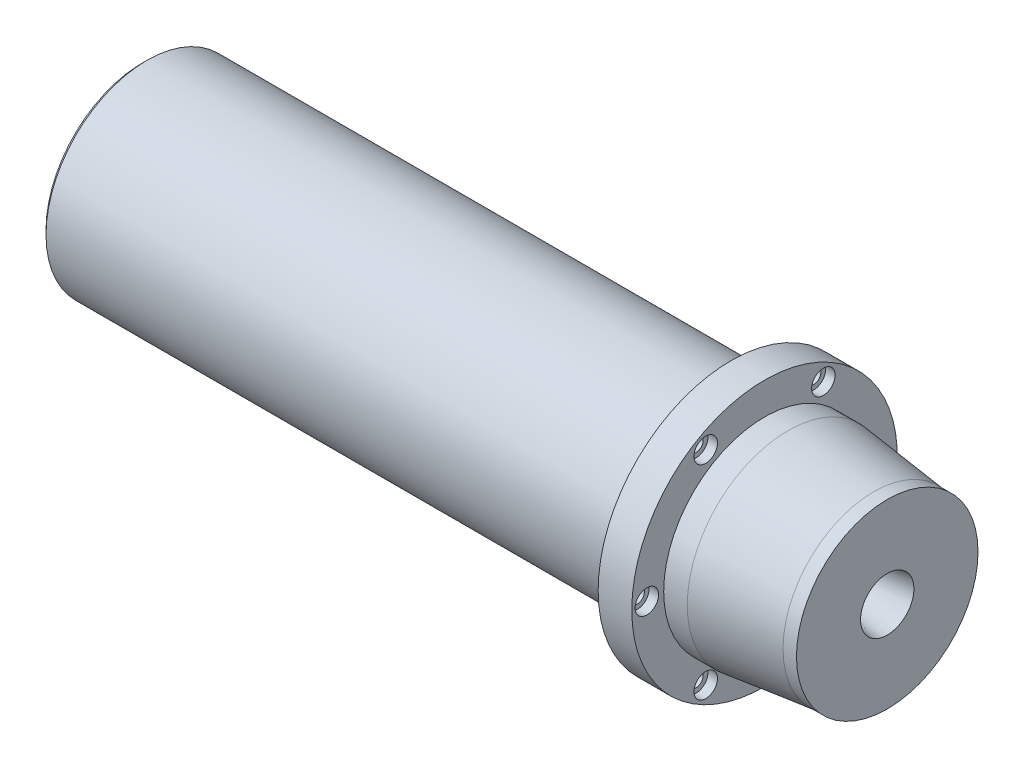
ISO-10303-21;
HEADER;
FILE_DESCRIPTION(('STEP AP214'),'2;1');
FILE_NAME('part.step','',(''),(''),'','','');
FILE_SCHEMA(('AUTOMOTIVE_DESIGN { 1 0 10303 214 1 1 1 1 }'));
ENDSEC;
DATA;
#1=APPLICATION_CONTEXT('core data for automotive mechanical design processes');
#2=APPLICATION_PROTOCOL_DEFINITION('international standard','automotive_design',2000,#1);
#3=PRODUCT_CONTEXT('',#1,'mechanical');
#4=PRODUCT('Part','Part','',(#3));
#5=PRODUCT_RELATED_PRODUCT_CATEGORY('part','',(#4));
#6=PRODUCT_DEFINITION_FORMATION('','',#4);
#7=PRODUCT_DEFINITION_CONTEXT('part definition',#1,'design');
#8=PRODUCT_DEFINITION('design','',#6,#7);
#9=PRODUCT_DEFINITION_SHAPE('','',#8);
#10=(LENGTH_UNIT() NAMED_UNIT(*) SI_UNIT(.MILLI.,.METRE.));
#11=(NAMED_UNIT(*) PLANE_ANGLE_UNIT() SI_UNIT($,.RADIAN.));
#12=(NAMED_UNIT(*) SI_UNIT($,.STERADIAN.) SOLID_ANGLE_UNIT());
#13=UNCERTAINTY_MEASURE_WITH_UNIT(LENGTH_MEASURE(1.E-05),#10,'distance_accuracy_value','');
#14=(GEOMETRIC_REPRESENTATION_CONTEXT(3) GLOBAL_UNCERTAINTY_ASSIGNED_CONTEXT((#13)) GLOBAL_UNIT_ASSIGNED_CONTEXT((#10,
#11,#12)) REPRESENTATION_CONTEXT('',''));
#15=CARTESIAN_POINT('',(0.,0.,0.));
#16=DIRECTION('',(0.,0.,1.));
#17=DIRECTION('',(1.,0.,0.));
#18=AXIS2_PLACEMENT_3D('',#15,#16,#17);
#19=CARTESIAN_POINT('',(0.,0.,0.));
#20=DIRECTION('',(1.,0.,0.));
#21=DIRECTION('',(0.,0.,-1.));
#22=AXIS2_PLACEMENT_3D('',#19,#20,#21);
#23=PLANE('',#22);
#24=CARTESIAN_POINT('',(0.,0.,0.));
#25=DIRECTION('',(1.,0.,0.));
#26=DIRECTION('',(0.,0.,-1.));
#27=AXIS2_PLACEMENT_3D('',#24,#25,#26);
#28=CIRCLE('',#27,57.5);
#29=CARTESIAN_POINT('',(0.,0.,-57.5));
#30=VERTEX_POINT('',#29);
#31=EDGE_CURVE('E54',#30,#30,#28,.F.);
#32=ORIENTED_EDGE('',*,*,#31,.T.);
#33=EDGE_LOOP('',(#32));
#34=FACE_BOUND('',#33,.T.);
#35=ADVANCED_FACE('F44',(#34),#23,.F.);
#36=CARTESIAN_POINT('',(0.,0.,0.));
#37=DIRECTION('',(-1.,0.,0.));
#38=DIRECTION('',(0.,0.,1.));
#39=AXIS2_PLACEMENT_3D('',#36,#37,#38);
#40=CYLINDRICAL_SURFACE('',#39,60.);
#41=CARTESIAN_POINT('',(2.49999999999991,0.,0.));
#42=DIRECTION('',(1.,0.,0.));
#43=DIRECTION('',(0.,0.,-1.));
#44=AXIS2_PLACEMENT_3D('',#41,#42,#43);
#45=CIRCLE('',#44,60.);
#46=CARTESIAN_POINT('',(2.49999999999991,0.,-60.));
#47=VERTEX_POINT('',#46);
#48=EDGE_CURVE('E10',#47,#47,#45,.T.);
#49=ORIENTED_EDGE('',*,*,#48,.T.);
#50=EDGE_LOOP('',(#49));
#51=FACE_BOUND('',#50,.T.);
#52=CARTESIAN_POINT('',(350.,0.,0.));
#53=DIRECTION('',(-1.,0.,0.));
#54=DIRECTION('',(0.,0.,1.));
#55=AXIS2_PLACEMENT_3D('',#52,#53,#54);
#56=CIRCLE('',#55,60.);
#57=CARTESIAN_POINT('',(350.,0.,60.));
#58=VERTEX_POINT('',#57);
#59=EDGE_CURVE('E62',#58,#58,#56,.T.);
#60=ORIENTED_EDGE('',*,*,#59,.T.);
#61=EDGE_LOOP('',(#60));
#62=FACE_BOUND('',#61,.T.);
#63=ADVANCED_FACE('F183',(#51,#62),#40,.T.);
#64=CARTESIAN_POINT('',(350.,0.,-60.));
#65=DIRECTION('',(1.,0.,0.));
#66=DIRECTION('',(0.,0.,-1.));
#67=AXIS2_PLACEMENT_3D('',#64,#65,#66);
#68=PLANE('',#67);
#69=CARTESIAN_POINT('',(350.,0.,70.));
#70=DIRECTION('',(1.,0.,0.));
#71=DIRECTION('',(0.,0.,-1.));
#72=AXIS2_PLACEMENT_3D('',#69,#70,#71);
#73=CIRCLE('',#72,4.19999999999996);
#74=CARTESIAN_POINT('',(350.,0.,65.8000000000001));
#75=VERTEX_POINT('',#74);
#76=EDGE_CURVE('E49',#75,#75,#73,.T.);
#77=ORIENTED_EDGE('',*,*,#76,.T.);
#78=EDGE_LOOP('',(#77));
#79=FACE_BOUND('',#78,.T.);
#80=CARTESIAN_POINT('',(350.,60.6217782649107,35.));
#81=DIRECTION('',(1.,0.,0.));
#82=DIRECTION('',(0.,0.,-1.));
#83=AXIS2_PLACEMENT_3D('',#80,#81,#82);
#84=CIRCLE('',#83,4.19999999999996);
#85=CARTESIAN_POINT('',(350.,60.6217782649107,30.8000000000001));
#86=VERTEX_POINT('',#85);
#87=EDGE_CURVE('E86',#86,#86,#84,.T.);
#88=ORIENTED_EDGE('',*,*,#87,.T.);
#89=EDGE_LOOP('',(#88));
#90=FACE_BOUND('',#89,.T.);
#91=CARTESIAN_POINT('',(350.,60.6217782649107,-35.));
#92=DIRECTION('',(1.,0.,0.));
#93=DIRECTION('',(0.,0.,-1.));
#94=AXIS2_PLACEMENT_3D('',#91,#92,#93);
#95=CIRCLE('',#94,4.19999999999996);
#96=CARTESIAN_POINT('',(350.,60.6217782649107,-39.2));
#97=VERTEX_POINT('',#96);
#98=EDGE_CURVE('E84',#97,#97,#95,.T.);
#99=ORIENTED_EDGE('',*,*,#98,.T.);
#100=EDGE_LOOP('',(#99));
#101=FACE_BOUND('',#100,.T.);
#102=CARTESIAN_POINT('',(350.,0.,-70.));
#103=DIRECTION('',(1.,0.,0.));
#104=DIRECTION('',(0.,0.,-1.));
#105=AXIS2_PLACEMENT_3D('',#102,#103,#104);
#106=CIRCLE('',#105,4.19999999999996);
#107=CARTESIAN_POINT('',(350.,0.,-74.2));
#108=VERTEX_POINT('',#107);
#109=EDGE_CURVE('E80',#108,#108,#106,.T.);
#110=ORIENTED_EDGE('',*,*,#109,.T.);
#111=EDGE_LOOP('',(#110));
#112=FACE_BOUND('',#111,.T.);
#113=CARTESIAN_POINT('',(350.,-60.6217782649107,-35.));
#114=DIRECTION('',(1.,0.,0.));
#115=DIRECTION('',(0.,0.,-1.));
#116=AXIS2_PLACEMENT_3D('',#113,#114,#115);
#117=CIRCLE('',#116,4.19999999999996);
#118=CARTESIAN_POINT('',(350.,-60.6217782649107,-39.2));
#119=VERTEX_POINT('',#118);
#120=EDGE_CURVE('E72',#119,#119,#117,.T.);
#121=ORIENTED_EDGE('',*,*,#120,.T.);
#122=EDGE_LOOP('',(#121));
#123=FACE_BOUND('',#122,.T.);
#124=CARTESIAN_POINT('',(350.,-60.6217782649107,35.));
#125=DIRECTION('',(1.,0.,0.));
#126=DIRECTION('',(0.,0.,-1.));
#127=AXIS2_PLACEMENT_3D('',#124,#125,#126);
#128=CIRCLE('',#127,4.19999999999996);
#129=CARTESIAN_POINT('',(350.,-60.6217782649107,30.8000000000001));
#130=VERTEX_POINT('',#129);
#131=EDGE_CURVE('E61',#130,#130,#128,.T.);
#132=ORIENTED_EDGE('',*,*,#131,.T.);
#133=EDGE_LOOP('',(#132));
#134=FACE_BOUND('',#133,.T.);
#135=ORIENTED_EDGE('',*,*,#59,.F.);
#136=EDGE_LOOP('',(#135));
#137=FACE_BOUND('',#136,.T.);
#138=CARTESIAN_POINT('',(350.,0.,0.));
#139=DIRECTION('',(-1.,0.,0.));
#140=DIRECTION('',(0.,0.,1.));
#141=AXIS2_PLACEMENT_3D('',#138,#139,#140);
#142=CIRCLE('',#141,79.);
#143=CARTESIAN_POINT('',(350.,0.,79.));
#144=VERTEX_POINT('',#143);
#145=EDGE_CURVE('E179',#144,#144,#142,.T.);
#146=ORIENTED_EDGE('',*,*,#145,.T.);
#147=EDGE_LOOP('',(#146));
#148=FACE_BOUND('',#147,.T.);
#149=ADVANCED_FACE('F190',(#79,#90,#101,#112,#123,#134,#137,#148),#68,.F.);
#150=CARTESIAN_POINT('',(0.,0.,0.));
#151=DIRECTION('',(-1.,0.,0.));
#152=DIRECTION('',(0.,0.,1.));
#153=AXIS2_PLACEMENT_3D('',#150,#151,#152);
#154=CYLINDRICAL_SURFACE('',#153,79.);
#155=ORIENTED_EDGE('',*,*,#145,.F.);
#156=EDGE_LOOP('',(#155));
#157=FACE_BOUND('',#156,.T.);
#158=CARTESIAN_POINT('',(370.,0.,0.));
#159=DIRECTION('',(-1.,0.,0.));
#160=DIRECTION('',(0.,0.,1.));
#161=AXIS2_PLACEMENT_3D('',#158,#159,#160);
#162=CIRCLE('',#161,79.);
#163=CARTESIAN_POINT('',(370.,0.,79.));
#164=VERTEX_POINT('',#163);
#165=EDGE_CURVE('E174',#164,#164,#162,.T.);
#166=ORIENTED_EDGE('',*,*,#165,.T.);
#167=EDGE_LOOP('',(#166));
#168=FACE_BOUND('',#167,.T.);
#169=ADVANCED_FACE('F186',(#157,#168),#154,.T.);
#170=CARTESIAN_POINT('',(370.,0.,-79.));
#171=DIRECTION('',(-1.,0.,0.));
#172=DIRECTION('',(0.,0.,1.));
#173=AXIS2_PLACEMENT_3D('',#170,#171,#172);
#174=PLANE('',#173);
#175=CARTESIAN_POINT('',(370.,0.,70.));
#176=DIRECTION('',(1.,0.,0.));
#177=DIRECTION('',(0.,0.,-1.));
#178=AXIS2_PLACEMENT_3D('',#175,#176,#177);
#179=CIRCLE('',#178,7.);
#180=CARTESIAN_POINT('',(370.,0.,63.));
#181=VERTEX_POINT('',#180);
#182=EDGE_CURVE('E520',#181,#181,#179,.T.);
#183=ORIENTED_EDGE('',*,*,#182,.F.);
#184=EDGE_LOOP('',(#183));
#185=FACE_BOUND('',#184,.T.);
#186=CARTESIAN_POINT('',(370.,60.6217782649107,35.));
#187=DIRECTION('',(1.,0.,0.));
#188=DIRECTION('',(0.,0.,-1.));
#189=AXIS2_PLACEMENT_3D('',#186,#187,#188);
#190=CIRCLE('',#189,6.99999999999999);
#191=CARTESIAN_POINT('',(370.,60.6217782649107,28.));
#192=VERTEX_POINT('',#191);
#193=EDGE_CURVE('E110',#192,#192,#190,.T.);
#194=ORIENTED_EDGE('',*,*,#193,.F.);
#195=EDGE_LOOP('',(#194));
#196=FACE_BOUND('',#195,.T.);
#197=CARTESIAN_POINT('',(370.,60.6217782649107,-35.));
#198=DIRECTION('',(1.,0.,0.));
#199=DIRECTION('',(0.,0.,-1.));
#200=AXIS2_PLACEMENT_3D('',#197,#198,#199);
#201=CIRCLE('',#200,7.);
#202=CARTESIAN_POINT('',(370.,60.6217782649107,-42.));
#203=VERTEX_POINT('',#202);
#204=EDGE_CURVE('E93',#203,#203,#201,.T.);
#205=ORIENTED_EDGE('',*,*,#204,.F.);
#206=EDGE_LOOP('',(#205));
#207=FACE_BOUND('',#206,.T.);
#208=CARTESIAN_POINT('',(370.,0.,-70.));
#209=DIRECTION('',(1.,0.,0.));
#210=DIRECTION('',(0.,0.,-1.));
#211=AXIS2_PLACEMENT_3D('',#208,#209,#210);
#212=CIRCLE('',#211,7.);
#213=CARTESIAN_POINT('',(370.,0.,-77.));
#214=VERTEX_POINT('',#213);
#215=EDGE_CURVE('E88',#214,#214,#212,.T.);
#216=ORIENTED_EDGE('',*,*,#215,.F.);
#217=EDGE_LOOP('',(#216));
#218=FACE_BOUND('',#217,.T.);
#219=CARTESIAN_POINT('',(370.,-60.6217782649107,-35.));
#220=DIRECTION('',(1.,0.,0.));
#221=DIRECTION('',(0.,0.,-1.));
#222=AXIS2_PLACEMENT_3D('',#219,#220,#221);
#223=CIRCLE('',#222,7.);
#224=CARTESIAN_POINT('',(370.,-60.6217782649107,-42.));
#225=VERTEX_POINT('',#224);
#226=EDGE_CURVE('E82',#225,#225,#223,.T.);
#227=ORIENTED_EDGE('',*,*,#226,.F.);
#228=EDGE_LOOP('',(#227));
#229=FACE_BOUND('',#228,.T.);
#230=CARTESIAN_POINT('',(370.,-60.6217782649107,35.));
#231=DIRECTION('',(1.,0.,0.));
#232=DIRECTION('',(0.,0.,-1.));
#233=AXIS2_PLACEMENT_3D('',#230,#231,#232);
#234=CIRCLE('',#233,7.);
#235=CARTESIAN_POINT('',(370.,-60.6217782649107,28.));
#236=VERTEX_POINT('',#235);
#237=EDGE_CURVE('E73',#236,#236,#234,.T.);
#238=ORIENTED_EDGE('',*,*,#237,.F.);
#239=EDGE_LOOP('',(#238));
#240=FACE_BOUND('',#239,.T.);
#241=ORIENTED_EDGE('',*,*,#165,.F.);
#242=EDGE_LOOP('',(#241));
#243=FACE_BOUND('',#242,.T.);
#244=CARTESIAN_POINT('',(370.,0.,0.));
#245=DIRECTION('',(-1.,0.,0.));
#246=DIRECTION('',(0.,0.,1.));
#247=AXIS2_PLACEMENT_3D('',#244,#245,#246);
#248=CIRCLE('',#247,60.);
#249=CARTESIAN_POINT('',(370.,0.,60.));
#250=VERTEX_POINT('',#249);
#251=EDGE_CURVE('E168',#250,#250,#248,.T.);
#252=ORIENTED_EDGE('',*,*,#251,.T.);
#253=EDGE_LOOP('',(#252));
#254=FACE_BOUND('',#253,.T.);
#255=ADVANCED_FACE('F197',(#185,#196,#207,#218,#229,#240,#243,#254),#174,.F.);
#256=CARTESIAN_POINT('',(0.,0.,0.));
#257=DIRECTION('',(-1.,0.,0.));
#258=DIRECTION('',(0.,0.,1.));
#259=AXIS2_PLACEMENT_3D('',#256,#257,#258);
#260=CYLINDRICAL_SURFACE('',#259,60.);
#261=ORIENTED_EDGE('',*,*,#251,.F.);
#262=EDGE_LOOP('',(#261));
#263=FACE_BOUND('',#262,.T.);
#264=CARTESIAN_POINT('',(384.,0.,0.));
#265=DIRECTION('',(-1.,0.,0.));
#266=DIRECTION('',(0.,0.,1.));
#267=AXIS2_PLACEMENT_3D('',#264,#265,#266);
#268=CIRCLE('',#267,60.);
#269=CARTESIAN_POINT('',(384.,0.,60.));
#270=VERTEX_POINT('',#269);
#271=EDGE_CURVE('E167',#270,#270,#268,.T.);
#272=ORIENTED_EDGE('',*,*,#271,.T.);
#273=EDGE_LOOP('',(#272));
#274=FACE_BOUND('',#273,.T.);
#275=ADVANCED_FACE('F201',(#263,#274),#260,.T.);
#276=CARTESIAN_POINT('',(435.,0.,0.));
#277=DIRECTION('',(-1.,0.,0.));
#278=DIRECTION('',(0.,0.,1.));
#279=AXIS2_PLACEMENT_3D('',#276,#277,#278);
#280=CONICAL_SURFACE('',#279,54.,0.117108744566864);
#281=ORIENTED_EDGE('',*,*,#271,.F.);
#282=EDGE_LOOP('',(#281));
#283=FACE_BOUND('',#282,.T.);
#284=CARTESIAN_POINT('',(435.,0.,0.));
#285=DIRECTION('',(-1.,0.,0.));
#286=DIRECTION('',(0.,0.,1.));
#287=AXIS2_PLACEMENT_3D('',#284,#285,#286);
#288=CIRCLE('',#287,54.);
#289=CARTESIAN_POINT('',(435.,0.,54.));
#290=VERTEX_POINT('',#289);
#291=EDGE_CURVE('E165',#290,#290,#288,.T.);
#292=ORIENTED_EDGE('',*,*,#291,.T.);
#293=EDGE_LOOP('',(#292));
#294=FACE_BOUND('',#293,.T.);
#295=ADVANCED_FACE('F209',(#283,#294),#280,.T.);
#296=CARTESIAN_POINT('',(0.,0.,0.));
#297=DIRECTION('',(-1.,0.,0.));
#298=DIRECTION('',(0.,0.,1.));
#299=AXIS2_PLACEMENT_3D('',#296,#297,#298);
#300=CYLINDRICAL_SURFACE('',#299,54.);
#301=ORIENTED_EDGE('',*,*,#291,.F.);
#302=EDGE_LOOP('',(#301));
#303=FACE_BOUND('',#302,.T.);
#304=CARTESIAN_POINT('',(443.,0.,0.));
#305=DIRECTION('',(-1.,0.,0.));
#306=DIRECTION('',(0.,0.,1.));
#307=AXIS2_PLACEMENT_3D('',#304,#305,#306);
#308=CIRCLE('',#307,54.);
#309=CARTESIAN_POINT('',(443.,0.,54.));
#310=VERTEX_POINT('',#309);
#311=EDGE_CURVE('E158',#310,#310,#308,.T.);
#312=ORIENTED_EDGE('',*,*,#311,.T.);
#313=EDGE_LOOP('',(#312));
#314=FACE_BOUND('',#313,.T.);
#315=ADVANCED_FACE('F216',(#303,#314),#300,.T.);
#316=CARTESIAN_POINT('',(443.,0.,-15.875));
#317=DIRECTION('',(-1.,0.,0.));
#318=DIRECTION('',(0.,0.,1.));
#319=AXIS2_PLACEMENT_3D('',#316,#317,#318);
#320=PLANE('',#319);
#321=ORIENTED_EDGE('',*,*,#311,.F.);
#322=EDGE_LOOP('',(#321));
#323=FACE_BOUND('',#322,.T.);
#324=CARTESIAN_POINT('',(443.,0.,0.));
#325=DIRECTION('',(-1.,0.,0.));
#326=DIRECTION('',(0.,0.,1.));
#327=AXIS2_PLACEMENT_3D('',#324,#325,#326);
#328=CIRCLE('',#327,15.875);
#329=CARTESIAN_POINT('',(443.,0.,15.875));
#330=VERTEX_POINT('',#329);
#331=EDGE_CURVE('E152',#330,#330,#328,.T.);
#332=ORIENTED_EDGE('',*,*,#331,.T.);
#333=EDGE_LOOP('',(#332));
#334=FACE_BOUND('',#333,.T.);
#335=ADVANCED_FACE('F225',(#323,#334),#320,.F.);
#336=CARTESIAN_POINT('',(394.6,0.,0.));
#337=DIRECTION('',(1.,0.,0.));
#338=DIRECTION('',(0.,0.,-1.));
#339=AXIS2_PLACEMENT_3D('',#336,#337,#338);
#340=CONICAL_SURFACE('',#339,8.81649999999999,0.144815870053812);
#341=ORIENTED_EDGE('',*,*,#331,.F.);
#342=EDGE_LOOP('',(#341));
#343=FACE_BOUND('',#342,.T.);
#344=CARTESIAN_POINT('',(394.6,0.,0.));
#345=DIRECTION('',(-1.,0.,0.));
#346=DIRECTION('',(0.,0.,1.));
#347=AXIS2_PLACEMENT_3D('',#344,#345,#346);
#348=CIRCLE('',#347,8.81649999999999);
#349=CARTESIAN_POINT('',(394.6,0.,8.81649999999999));
#350=VERTEX_POINT('',#349);
#351=EDGE_CURVE('E147',#350,#350,#348,.T.);
#352=ORIENTED_EDGE('',*,*,#351,.T.);
#353=EDGE_LOOP('',(#352));
#354=FACE_BOUND('',#353,.T.);
#355=ADVANCED_FACE('F228',(#343,#354),#340,.F.);
#356=CARTESIAN_POINT('',(0.,0.,0.));
#357=DIRECTION('',(-1.,0.,0.));
#358=DIRECTION('',(0.,0.,1.));
#359=AXIS2_PLACEMENT_3D('',#356,#357,#358);
#360=CYLINDRICAL_SURFACE('',#359,8.81649999999999);
#361=ORIENTED_EDGE('',*,*,#351,.F.);
#362=EDGE_LOOP('',(#361));
#363=FACE_BOUND('',#362,.T.);
#364=CARTESIAN_POINT('',(382.6,0.,0.));
#365=DIRECTION('',(-1.,0.,0.));
#366=DIRECTION('',(0.,0.,1.));
#367=AXIS2_PLACEMENT_3D('',#364,#365,#366);
#368=CIRCLE('',#367,8.81649999999999);
#369=CARTESIAN_POINT('',(382.6,0.,8.81649999999999));
#370=VERTEX_POINT('',#369);
#371=EDGE_CURVE('E66',#370,#370,#368,.T.);
#372=ORIENTED_EDGE('',*,*,#371,.T.);
#373=EDGE_LOOP('',(#372));
#374=FACE_BOUND('',#373,.T.);
#375=ADVANCED_FACE('F231',(#363,#374),#360,.F.);
#376=CARTESIAN_POINT('',(382.6,0.,-8.81649999999999));
#377=DIRECTION('',(-1.,0.,0.));
#378=DIRECTION('',(0.,0.,1.));
#379=AXIS2_PLACEMENT_3D('',#376,#377,#378);
#380=PLANE('',#379);
#381=ORIENTED_EDGE('',*,*,#371,.F.);
#382=EDGE_LOOP('',(#381));
#383=FACE_BOUND('',#382,.T.);
#384=ADVANCED_FACE('F238',(#383),#380,.F.);
#385=CARTESIAN_POINT('',(0.,0.,0.));
#386=DIRECTION('',(1.,0.,0.));
#387=DIRECTION('',(0.,0.,-1.));
#388=AXIS2_PLACEMENT_3D('',#385,#386,#387);
#389=CONICAL_SURFACE('',#388,57.5,0.785398163397455);
#390=ORIENTED_EDGE('',*,*,#48,.F.);
#391=EDGE_LOOP('',(#390));
#392=FACE_BOUND('',#391,.T.);
#393=ORIENTED_EDGE('',*,*,#31,.F.);
#394=EDGE_LOOP('',(#393));
#395=FACE_BOUND('',#394,.T.);
#396=ADVANCED_FACE('F48',(#392,#395),#389,.T.);
#397=CARTESIAN_POINT('',(370.,-60.6217782649107,35.));
#398=DIRECTION('',(1.,0.,0.));
#399=DIRECTION('',(0.,0.,-1.));
#400=AXIS2_PLACEMENT_3D('',#397,#398,#399);
#401=CYLINDRICAL_SURFACE('',#400,4.19999999999996);
#402=CARTESIAN_POINT('',(364.32,-60.6217782649107,35.));
#403=DIRECTION('',(1.,0.,0.));
#404=DIRECTION('',(0.,0.,-1.));
#405=AXIS2_PLACEMENT_3D('',#402,#403,#404);
#406=CIRCLE('',#405,4.20000000000001);
#407=CARTESIAN_POINT('',(364.32,-60.6217782649107,30.8));
#408=VERTEX_POINT('',#407);
#409=EDGE_CURVE('E68',#408,#408,#406,.T.);
#410=ORIENTED_EDGE('',*,*,#409,.T.);
#411=EDGE_LOOP('',(#410));
#412=FACE_BOUND('',#411,.T.);
#413=ORIENTED_EDGE('',*,*,#131,.F.);
#414=EDGE_LOOP('',(#413));
#415=FACE_BOUND('',#414,.T.);
#416=ADVANCED_FACE('F248',(#412,#415),#401,.F.);
#417=CARTESIAN_POINT('',(364.32,-56.4217782649107,35.));
#418=DIRECTION('',(-1.,0.,0.));
#419=DIRECTION('',(0.,0.,1.));
#420=AXIS2_PLACEMENT_3D('',#417,#418,#419);
#421=PLANE('',#420);
#422=ORIENTED_EDGE('',*,*,#409,.F.);
#423=EDGE_LOOP('',(#422));
#424=FACE_BOUND('',#423,.T.);
#425=CARTESIAN_POINT('',(364.32,-60.6217782649107,35.));
#426=DIRECTION('',(1.,0.,0.));
#427=DIRECTION('',(0.,0.,-1.));
#428=AXIS2_PLACEMENT_3D('',#425,#426,#427);
#429=CIRCLE('',#428,7.);
#430=CARTESIAN_POINT('',(364.32,-60.6217782649107,28.));
#431=VERTEX_POINT('',#430);
#432=EDGE_CURVE('E138',#431,#431,#429,.T.);
#433=ORIENTED_EDGE('',*,*,#432,.T.);
#434=EDGE_LOOP('',(#433));
#435=FACE_BOUND('',#434,.T.);
#436=ADVANCED_FACE('F287',(#424,#435),#421,.F.);
#437=CARTESIAN_POINT('',(370.,-60.6217782649107,35.));
#438=DIRECTION('',(1.,0.,0.));
#439=DIRECTION('',(0.,0.,-1.));
#440=AXIS2_PLACEMENT_3D('',#437,#438,#439);
#441=CYLINDRICAL_SURFACE('',#440,7.);
#442=ORIENTED_EDGE('',*,*,#432,.F.);
#443=EDGE_LOOP('',(#442));
#444=FACE_BOUND('',#443,.T.);
#445=ORIENTED_EDGE('',*,*,#237,.T.);
#446=EDGE_LOOP('',(#445));
#447=FACE_BOUND('',#446,.T.);
#448=ADVANCED_FACE('F294',(#444,#447),#441,.F.);
#449=CARTESIAN_POINT('',(370.,-60.6217782649107,-35.));
#450=DIRECTION('',(1.,0.,0.));
#451=DIRECTION('',(0.,0.,-1.));
#452=AXIS2_PLACEMENT_3D('',#449,#450,#451);
#453=CYLINDRICAL_SURFACE('',#452,4.19999999999996);
#454=CARTESIAN_POINT('',(364.32,-60.6217782649107,-35.));
#455=DIRECTION('',(1.,0.,0.));
#456=DIRECTION('',(0.,0.,-1.));
#457=AXIS2_PLACEMENT_3D('',#454,#455,#456);
#458=CIRCLE('',#457,4.20000000000001);
#459=CARTESIAN_POINT('',(364.32,-60.6217782649107,-39.2));
#460=VERTEX_POINT('',#459);
#461=EDGE_CURVE('E77',#460,#460,#458,.T.);
#462=ORIENTED_EDGE('',*,*,#461,.T.);
#463=EDGE_LOOP('',(#462));
#464=FACE_BOUND('',#463,.T.);
#465=ORIENTED_EDGE('',*,*,#120,.F.);
#466=EDGE_LOOP('',(#465));
#467=FACE_BOUND('',#466,.T.);
#468=ADVANCED_FACE('F304',(#464,#467),#453,.F.);
#469=CARTESIAN_POINT('',(364.32,-56.4217782649107,-35.));
#470=DIRECTION('',(-1.,0.,0.));
#471=DIRECTION('',(0.,0.,1.));
#472=AXIS2_PLACEMENT_3D('',#469,#470,#471);
#473=PLANE('',#472);
#474=ORIENTED_EDGE('',*,*,#461,.F.);
#475=EDGE_LOOP('',(#474));
#476=FACE_BOUND('',#475,.T.);
#477=CARTESIAN_POINT('',(364.32,-60.6217782649107,-35.));
#478=DIRECTION('',(1.,0.,0.));
#479=DIRECTION('',(0.,0.,-1.));
#480=AXIS2_PLACEMENT_3D('',#477,#478,#479);
#481=CIRCLE('',#480,7.);
#482=CARTESIAN_POINT('',(364.32,-60.6217782649107,-42.));
#483=VERTEX_POINT('',#482);
#484=EDGE_CURVE('E128',#483,#483,#481,.T.);
#485=ORIENTED_EDGE('',*,*,#484,.T.);
#486=EDGE_LOOP('',(#485));
#487=FACE_BOUND('',#486,.T.);
#488=ADVANCED_FACE('F315',(#476,#487),#473,.F.);
#489=CARTESIAN_POINT('',(370.,-60.6217782649107,-35.));
#490=DIRECTION('',(1.,0.,0.));
#491=DIRECTION('',(0.,0.,-1.));
#492=AXIS2_PLACEMENT_3D('',#489,#490,#491);
#493=CYLINDRICAL_SURFACE('',#492,7.);
#494=ORIENTED_EDGE('',*,*,#484,.F.);
#495=EDGE_LOOP('',(#494));
#496=FACE_BOUND('',#495,.T.);
#497=ORIENTED_EDGE('',*,*,#226,.T.);
#498=EDGE_LOOP('',(#497));
#499=FACE_BOUND('',#498,.T.);
#500=ADVANCED_FACE('F321',(#496,#499),#493,.F.);
#501=CARTESIAN_POINT('',(370.,0.,-70.));
#502=DIRECTION('',(1.,0.,0.));
#503=DIRECTION('',(0.,0.,-1.));
#504=AXIS2_PLACEMENT_3D('',#501,#502,#503);
#505=CYLINDRICAL_SURFACE('',#504,4.19999999999996);
#506=CARTESIAN_POINT('',(364.32,0.,-70.));
#507=DIRECTION('',(1.,0.,0.));
#508=DIRECTION('',(0.,0.,-1.));
#509=AXIS2_PLACEMENT_3D('',#506,#507,#508);
#510=CIRCLE('',#509,4.20000000000001);
#511=CARTESIAN_POINT('',(364.32,0.,-74.2));
#512=VERTEX_POINT('',#511);
#513=EDGE_CURVE('E85',#512,#512,#510,.T.);
#514=ORIENTED_EDGE('',*,*,#513,.T.);
#515=EDGE_LOOP('',(#514));
#516=FACE_BOUND('',#515,.T.);
#517=ORIENTED_EDGE('',*,*,#109,.F.);
#518=EDGE_LOOP('',(#517));
#519=FACE_BOUND('',#518,.T.);
#520=ADVANCED_FACE('F329',(#516,#519),#505,.F.);
#521=CARTESIAN_POINT('',(364.32,4.20000000000002,-70.));
#522=DIRECTION('',(-1.,0.,0.));
#523=DIRECTION('',(0.,0.,1.));
#524=AXIS2_PLACEMENT_3D('',#521,#522,#523);
#525=PLANE('',#524);
#526=ORIENTED_EDGE('',*,*,#513,.F.);
#527=EDGE_LOOP('',(#526));
#528=FACE_BOUND('',#527,.T.);
#529=CARTESIAN_POINT('',(364.32,0.,-70.));
#530=DIRECTION('',(1.,0.,0.));
#531=DIRECTION('',(0.,0.,-1.));
#532=AXIS2_PLACEMENT_3D('',#529,#530,#531);
#533=CIRCLE('',#532,7.);
#534=CARTESIAN_POINT('',(364.32,0.,-77.));
#535=VERTEX_POINT('',#534);
#536=EDGE_CURVE('E116',#535,#535,#533,.T.);
#537=ORIENTED_EDGE('',*,*,#536,.T.);
#538=EDGE_LOOP('',(#537));
#539=FACE_BOUND('',#538,.T.);
#540=ADVANCED_FACE('F339',(#528,#539),#525,.F.);
#541=CARTESIAN_POINT('',(370.,0.,-70.));
#542=DIRECTION('',(1.,0.,0.));
#543=DIRECTION('',(0.,0.,-1.));
#544=AXIS2_PLACEMENT_3D('',#541,#542,#543);
#545=CYLINDRICAL_SURFACE('',#544,7.);
#546=ORIENTED_EDGE('',*,*,#536,.F.);
#547=EDGE_LOOP('',(#546));
#548=FACE_BOUND('',#547,.T.);
#549=ORIENTED_EDGE('',*,*,#215,.T.);
#550=EDGE_LOOP('',(#549));
#551=FACE_BOUND('',#550,.T.);
#552=ADVANCED_FACE('F346',(#548,#551),#545,.F.);
#553=CARTESIAN_POINT('',(370.,60.6217782649107,-35.));
#554=DIRECTION('',(1.,0.,0.));
#555=DIRECTION('',(0.,0.,-1.));
#556=AXIS2_PLACEMENT_3D('',#553,#554,#555);
#557=CYLINDRICAL_SURFACE('',#556,4.19999999999996);
#558=CARTESIAN_POINT('',(364.32,60.6217782649107,-35.));
#559=DIRECTION('',(1.,0.,0.));
#560=DIRECTION('',(0.,0.,-1.));
#561=AXIS2_PLACEMENT_3D('',#558,#559,#560);
#562=CIRCLE('',#561,4.20000000000002);
#563=CARTESIAN_POINT('',(364.32,60.6217782649107,-39.2));
#564=VERTEX_POINT('',#563);
#565=EDGE_CURVE('E87',#564,#564,#562,.T.);
#566=ORIENTED_EDGE('',*,*,#565,.T.);
#567=EDGE_LOOP('',(#566));
#568=FACE_BOUND('',#567,.T.);
#569=ORIENTED_EDGE('',*,*,#98,.F.);
#570=EDGE_LOOP('',(#569));
#571=FACE_BOUND('',#570,.T.);
#572=ADVANCED_FACE('F360',(#568,#571),#557,.F.);
#573=CARTESIAN_POINT('',(364.32,64.8217782649107,-35.));
#574=DIRECTION('',(-1.,0.,0.));
#575=DIRECTION('',(0.,0.,1.));
#576=AXIS2_PLACEMENT_3D('',#573,#574,#575);
#577=PLANE('',#576);
#578=ORIENTED_EDGE('',*,*,#565,.F.);
#579=EDGE_LOOP('',(#578));
#580=FACE_BOUND('',#579,.T.);
#581=CARTESIAN_POINT('',(364.32,60.6217782649107,-35.));
#582=DIRECTION('',(1.,0.,0.));
#583=DIRECTION('',(0.,0.,-1.));
#584=AXIS2_PLACEMENT_3D('',#581,#582,#583);
#585=CIRCLE('',#584,7.);
#586=CARTESIAN_POINT('',(364.32,60.6217782649107,-42.));
#587=VERTEX_POINT('',#586);
#588=EDGE_CURVE('E98',#587,#587,#585,.T.);
#589=ORIENTED_EDGE('',*,*,#588,.T.);
#590=EDGE_LOOP('',(#589));
#591=FACE_BOUND('',#590,.T.);
#592=ADVANCED_FACE('F368',(#580,#591),#577,.F.);
#593=CARTESIAN_POINT('',(370.,60.6217782649107,-35.));
#594=DIRECTION('',(1.,0.,0.));
#595=DIRECTION('',(0.,0.,-1.));
#596=AXIS2_PLACEMENT_3D('',#593,#594,#595);
#597=CYLINDRICAL_SURFACE('',#596,7.);
#598=ORIENTED_EDGE('',*,*,#588,.F.);
#599=EDGE_LOOP('',(#598));
#600=FACE_BOUND('',#599,.T.);
#601=ORIENTED_EDGE('',*,*,#204,.T.);
#602=EDGE_LOOP('',(#601));
#603=FACE_BOUND('',#602,.T.);
#604=ADVANCED_FACE('F374',(#600,#603),#597,.F.);
#605=CARTESIAN_POINT('',(370.,60.6217782649107,35.));
#606=DIRECTION('',(1.,0.,0.));
#607=DIRECTION('',(0.,0.,-1.));
#608=AXIS2_PLACEMENT_3D('',#605,#606,#607);
#609=CYLINDRICAL_SURFACE('',#608,4.19999999999996);
#610=CARTESIAN_POINT('',(364.32,60.6217782649107,35.));
#611=DIRECTION('',(1.,0.,0.));
#612=DIRECTION('',(0.,0.,-1.));
#613=AXIS2_PLACEMENT_3D('',#610,#611,#612);
#614=CIRCLE('',#613,4.20000000000001);
#615=CARTESIAN_POINT('',(364.32,60.6217782649107,30.8));
#616=VERTEX_POINT('',#615);
#617=EDGE_CURVE('E95',#616,#616,#614,.T.);
#618=ORIENTED_EDGE('',*,*,#617,.T.);
#619=EDGE_LOOP('',(#618));
#620=FACE_BOUND('',#619,.T.);
#621=ORIENTED_EDGE('',*,*,#87,.F.);
#622=EDGE_LOOP('',(#621));
#623=FACE_BOUND('',#622,.T.);
#624=ADVANCED_FACE('F383',(#620,#623),#609,.F.);
#625=CARTESIAN_POINT('',(364.32,64.8217782649107,35.));
#626=DIRECTION('',(-1.,0.,0.));
#627=DIRECTION('',(0.,0.,1.));
#628=AXIS2_PLACEMENT_3D('',#625,#626,#627);
#629=PLANE('',#628);
#630=ORIENTED_EDGE('',*,*,#617,.F.);
#631=EDGE_LOOP('',(#630));
#632=FACE_BOUND('',#631,.T.);
#633=CARTESIAN_POINT('',(364.32,60.6217782649107,35.));
#634=DIRECTION('',(1.,0.,0.));
#635=DIRECTION('',(0.,0.,-1.));
#636=AXIS2_PLACEMENT_3D('',#633,#634,#635);
#637=CIRCLE('',#636,6.99999999999999);
#638=CARTESIAN_POINT('',(364.32,60.6217782649107,28.));
#639=VERTEX_POINT('',#638);
#640=EDGE_CURVE('E101',#639,#639,#637,.T.);
#641=ORIENTED_EDGE('',*,*,#640,.T.);
#642=EDGE_LOOP('',(#641));
#643=FACE_BOUND('',#642,.T.);
#644=ADVANCED_FACE('F393',(#632,#643),#629,.F.);
#645=CARTESIAN_POINT('',(370.,60.6217782649107,35.));
#646=DIRECTION('',(1.,0.,0.));
#647=DIRECTION('',(0.,0.,-1.));
#648=AXIS2_PLACEMENT_3D('',#645,#646,#647);
#649=CYLINDRICAL_SURFACE('',#648,6.99999999999999);
#650=ORIENTED_EDGE('',*,*,#640,.F.);
#651=EDGE_LOOP('',(#650));
#652=FACE_BOUND('',#651,.T.);
#653=ORIENTED_EDGE('',*,*,#193,.T.);
#654=EDGE_LOOP('',(#653));
#655=FACE_BOUND('',#654,.T.);
#656=ADVANCED_FACE('F402',(#652,#655),#649,.F.);
#657=CARTESIAN_POINT('',(370.,0.,70.));
#658=DIRECTION('',(1.,0.,0.));
#659=DIRECTION('',(0.,0.,-1.));
#660=AXIS2_PLACEMENT_3D('',#657,#658,#659);
#661=CYLINDRICAL_SURFACE('',#660,4.19999999999996);
#662=CARTESIAN_POINT('',(364.32,0.,70.));
#663=DIRECTION('',(1.,0.,0.));
#664=DIRECTION('',(0.,0.,-1.));
#665=AXIS2_PLACEMENT_3D('',#662,#663,#664);
#666=CIRCLE('',#665,4.20000000000001);
#667=CARTESIAN_POINT('',(364.32,0.,65.8));
#668=VERTEX_POINT('',#667);
#669=EDGE_CURVE('E522',#668,#668,#666,.T.);
#670=ORIENTED_EDGE('',*,*,#669,.T.);
#671=EDGE_LOOP('',(#670));
#672=FACE_BOUND('',#671,.T.);
#673=ORIENTED_EDGE('',*,*,#76,.F.);
#674=EDGE_LOOP('',(#673));
#675=FACE_BOUND('',#674,.T.);
#676=ADVANCED_FACE('F406',(#672,#675),#661,.F.);
#677=CARTESIAN_POINT('',(364.32,4.20000000000001,70.));
#678=DIRECTION('',(-1.,0.,0.));
#679=DIRECTION('',(0.,0.,1.));
#680=AXIS2_PLACEMENT_3D('',#677,#678,#679);
#681=PLANE('',#680);
#682=ORIENTED_EDGE('',*,*,#669,.F.);
#683=EDGE_LOOP('',(#682));
#684=FACE_BOUND('',#683,.T.);
#685=CARTESIAN_POINT('',(364.32,0.,70.));
#686=DIRECTION('',(1.,0.,0.));
#687=DIRECTION('',(0.,0.,-1.));
#688=AXIS2_PLACEMENT_3D('',#685,#686,#687);
#689=CIRCLE('',#688,7.);
#690=CARTESIAN_POINT('',(364.32,0.,63.));
#691=VERTEX_POINT('',#690);
#692=EDGE_CURVE('E514',#691,#691,#689,.T.);
#693=ORIENTED_EDGE('',*,*,#692,.T.);
#694=EDGE_LOOP('',(#693));
#695=FACE_BOUND('',#694,.T.);
#696=ADVANCED_FACE('F420',(#684,#695),#681,.F.);
#697=CARTESIAN_POINT('',(370.,0.,70.));
#698=DIRECTION('',(1.,0.,0.));
#699=DIRECTION('',(0.,0.,-1.));
#700=AXIS2_PLACEMENT_3D('',#697,#698,#699);
#701=CYLINDRICAL_SURFACE('',#700,7.);
#702=ORIENTED_EDGE('',*,*,#692,.F.);
#703=EDGE_LOOP('',(#702));
#704=FACE_BOUND('',#703,.T.);
#705=ORIENTED_EDGE('',*,*,#182,.T.);
#706=EDGE_LOOP('',(#705));
#707=FACE_BOUND('',#706,.T.);
#708=ADVANCED_FACE('F428',(#704,#707),#701,.F.);
#709=CLOSED_SHELL('',(#35,#63,#149,#169,#255,#275,#295,#315,#335,#355,#375,#384,#396,#416,#436,
#448,#468,#488,#500,#520,#540,#552,#572,#592,#604,#624,#644,#656,#676,#696,#708));
#710=MANIFOLD_SOLID_BREP('B2',#709);
#711=ADVANCED_BREP_SHAPE_REPRESENTATION('',(#18,#710),#14);
#712=SHAPE_DEFINITION_REPRESENTATION(#9,#711);
ENDSEC;
END-ISO-10303-21;
